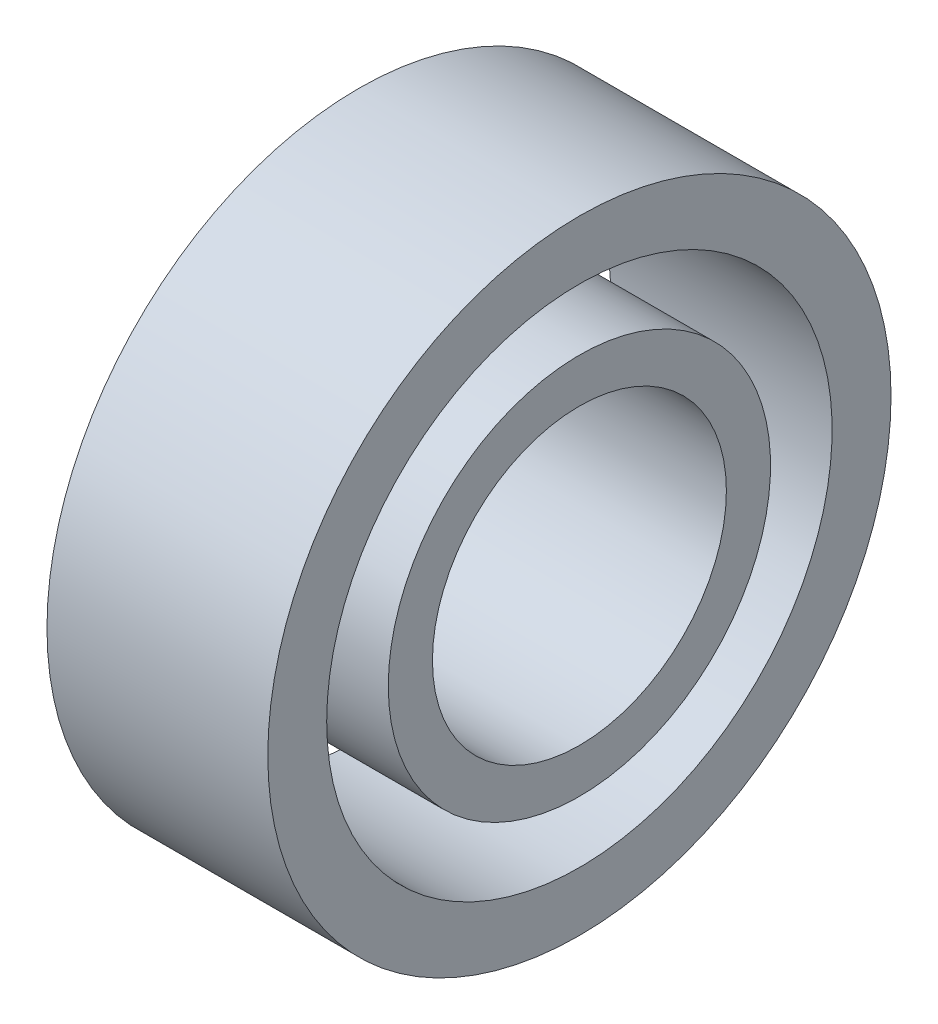
ISO-10303-21;
HEADER;
FILE_DESCRIPTION(('STEP AP214'),'2;1');
FILE_NAME('part.step','',(''),(''),'','','');
FILE_SCHEMA(('AUTOMOTIVE_DESIGN { 1 0 10303 214 1 1 1 1 }'));
ENDSEC;
DATA;
#1=APPLICATION_CONTEXT('core data for automotive mechanical design processes');
#2=APPLICATION_PROTOCOL_DEFINITION('international standard','automotive_design',2000,#1);
#3=PRODUCT_CONTEXT('',#1,'mechanical');
#4=PRODUCT('Part','Part','',(#3));
#5=PRODUCT_RELATED_PRODUCT_CATEGORY('part','',(#4));
#6=PRODUCT_DEFINITION_FORMATION('','',#4);
#7=PRODUCT_DEFINITION_CONTEXT('part definition',#1,'design');
#8=PRODUCT_DEFINITION('design','',#6,#7);
#9=PRODUCT_DEFINITION_SHAPE('','',#8);
#10=(LENGTH_UNIT() NAMED_UNIT(*) SI_UNIT(.MILLI.,.METRE.));
#11=(NAMED_UNIT(*) PLANE_ANGLE_UNIT() SI_UNIT($,.RADIAN.));
#12=(NAMED_UNIT(*) SI_UNIT($,.STERADIAN.) SOLID_ANGLE_UNIT());
#13=UNCERTAINTY_MEASURE_WITH_UNIT(LENGTH_MEASURE(1.E-05),#10,'distance_accuracy_value','');
#14=(GEOMETRIC_REPRESENTATION_CONTEXT(3) GLOBAL_UNCERTAINTY_ASSIGNED_CONTEXT((#13)) GLOBAL_UNIT_ASSIGNED_CONTEXT((#10,
#11,#12)) REPRESENTATION_CONTEXT('',''));
#15=CARTESIAN_POINT('',(0.,0.,0.));
#16=DIRECTION('',(0.,0.,1.));
#17=DIRECTION('',(1.,0.,0.));
#18=AXIS2_PLACEMENT_3D('',#15,#16,#17);
#19=CARTESIAN_POINT('',(-2.25,3.895,0.));
#20=DIRECTION('',(1.,0.,0.));
#21=DIRECTION('',(0.,0.,-1.));
#22=AXIS2_PLACEMENT_3D('',#19,#20,#21);
#23=PLANE('',#22);
#24=CARTESIAN_POINT('',(-2.25,0.,0.));
#25=DIRECTION('',(-1.,0.,0.));
#26=DIRECTION('',(0.,0.,1.));
#27=AXIS2_PLACEMENT_3D('',#24,#25,#26);
#28=CIRCLE('',#27,2.995);
#29=CARTESIAN_POINT('',(-2.25,0.,2.995));
#30=VERTEX_POINT('',#29);
#31=EDGE_CURVE('E11',#30,#30,#28,.T.);
#32=ORIENTED_EDGE('',*,*,#31,.F.);
#33=EDGE_LOOP('',(#32));
#34=FACE_BOUND('',#33,.T.);
#35=CARTESIAN_POINT('',(-2.25,0.,0.));
#36=DIRECTION('',(-1.,0.,0.));
#37=DIRECTION('',(0.,0.,1.));
#38=AXIS2_PLACEMENT_3D('',#35,#36,#37);
#39=CIRCLE('',#38,3.895);
#40=CARTESIAN_POINT('',(-2.25,0.,3.895));
#41=VERTEX_POINT('',#40);
#42=EDGE_CURVE('E59',#41,#41,#39,.T.);
#43=ORIENTED_EDGE('',*,*,#42,.T.);
#44=EDGE_LOOP('',(#43));
#45=FACE_BOUND('',#44,.T.);
#46=ADVANCED_FACE('F45',(#34,#45),#23,.F.);
#47=CARTESIAN_POINT('',(-11.7209302325581,0.,0.));
#48=DIRECTION('',(-1.,0.,0.));
#49=DIRECTION('',(0.,0.,1.));
#50=AXIS2_PLACEMENT_3D('',#47,#48,#49);
#51=CYLINDRICAL_SURFACE('',#50,2.995);
#52=CARTESIAN_POINT('',(2.25,0.,0.));
#53=DIRECTION('',(-1.,0.,0.));
#54=DIRECTION('',(0.,0.,1.));
#55=AXIS2_PLACEMENT_3D('',#52,#53,#54);
#56=CIRCLE('',#55,2.995);
#57=CARTESIAN_POINT('',(2.25,0.,2.995));
#58=VERTEX_POINT('',#57);
#59=EDGE_CURVE('E51',#58,#58,#56,.T.);
#60=ORIENTED_EDGE('',*,*,#59,.F.);
#61=EDGE_LOOP('',(#60));
#62=FACE_BOUND('',#61,.T.);
#63=ORIENTED_EDGE('',*,*,#31,.T.);
#64=EDGE_LOOP('',(#63));
#65=FACE_BOUND('',#64,.T.);
#66=ADVANCED_FACE('F74',(#62,#65),#51,.F.);
#67=CARTESIAN_POINT('',(2.25,3.895,0.));
#68=DIRECTION('',(-1.,0.,0.));
#69=DIRECTION('',(0.,0.,1.));
#70=AXIS2_PLACEMENT_3D('',#67,#68,#69);
#71=PLANE('',#70);
#72=CARTESIAN_POINT('',(2.25,0.,0.));
#73=DIRECTION('',(-1.,0.,0.));
#74=DIRECTION('',(0.,0.,1.));
#75=AXIS2_PLACEMENT_3D('',#72,#73,#74);
#76=CIRCLE('',#75,3.895);
#77=CARTESIAN_POINT('',(2.25,0.,3.895));
#78=VERTEX_POINT('',#77);
#79=EDGE_CURVE('E55',#78,#78,#76,.T.);
#80=ORIENTED_EDGE('',*,*,#79,.F.);
#81=EDGE_LOOP('',(#80));
#82=FACE_BOUND('',#81,.T.);
#83=ORIENTED_EDGE('',*,*,#59,.T.);
#84=EDGE_LOOP('',(#83));
#85=FACE_BOUND('',#84,.T.);
#86=ADVANCED_FACE('F69',(#82,#85),#71,.F.);
#87=CARTESIAN_POINT('',(-11.7209302325581,0.,0.));
#88=DIRECTION('',(-1.,0.,0.));
#89=DIRECTION('',(0.,0.,1.));
#90=AXIS2_PLACEMENT_3D('',#87,#88,#89);
#91=CYLINDRICAL_SURFACE('',#90,3.895);
#92=ORIENTED_EDGE('',*,*,#42,.F.);
#93=EDGE_LOOP('',(#92));
#94=FACE_BOUND('',#93,.T.);
#95=ORIENTED_EDGE('',*,*,#79,.T.);
#96=EDGE_LOOP('',(#95));
#97=FACE_BOUND('',#96,.T.);
#98=ADVANCED_FACE('F66',(#94,#97),#91,.T.);
#99=CLOSED_SHELL('',(#46,#66,#86,#98));
#100=MANIFOLD_SOLID_BREP('B2',#99);
#101=CARTESIAN_POINT('',(-2.25,6.35,0.));
#102=DIRECTION('',(1.,0.,0.));
#103=DIRECTION('',(0.,0.,-1.));
#104=AXIS2_PLACEMENT_3D('',#101,#102,#103);
#105=PLANE('',#104);
#106=CARTESIAN_POINT('',(-2.25,0.,0.));
#107=DIRECTION('',(-1.,0.,0.));
#108=DIRECTION('',(0.,0.,1.));
#109=AXIS2_PLACEMENT_3D('',#106,#107,#108);
#110=CIRCLE('',#109,5.15);
#111=CARTESIAN_POINT('',(-2.25,0.,5.15));
#112=VERTEX_POINT('',#111);
#113=EDGE_CURVE('E44',#112,#112,#110,.T.);
#114=ORIENTED_EDGE('',*,*,#113,.F.);
#115=EDGE_LOOP('',(#114));
#116=FACE_BOUND('',#115,.T.);
#117=CARTESIAN_POINT('',(-2.25,0.,0.));
#118=DIRECTION('',(-1.,0.,0.));
#119=DIRECTION('',(0.,0.,1.));
#120=AXIS2_PLACEMENT_3D('',#117,#118,#119);
#121=CIRCLE('',#120,6.35);
#122=CARTESIAN_POINT('',(-2.25,0.,6.35));
#123=VERTEX_POINT('',#122);
#124=EDGE_CURVE('E121',#123,#123,#121,.T.);
#125=ORIENTED_EDGE('',*,*,#124,.T.);
#126=EDGE_LOOP('',(#125));
#127=FACE_BOUND('',#126,.T.);
#128=ADVANCED_FACE('F107',(#116,#127),#105,.F.);
#129=CARTESIAN_POINT('',(-11.7209302325581,0.,0.));
#130=DIRECTION('',(-1.,0.,0.));
#131=DIRECTION('',(0.,0.,1.));
#132=AXIS2_PLACEMENT_3D('',#129,#130,#131);
#133=CYLINDRICAL_SURFACE('',#132,5.15);
#134=CARTESIAN_POINT('',(2.25,0.,0.));
#135=DIRECTION('',(-1.,0.,0.));
#136=DIRECTION('',(0.,0.,1.));
#137=AXIS2_PLACEMENT_3D('',#134,#135,#136);
#138=CIRCLE('',#137,5.15);
#139=CARTESIAN_POINT('',(2.25,0.,5.15));
#140=VERTEX_POINT('',#139);
#141=EDGE_CURVE('E113',#140,#140,#138,.T.);
#142=ORIENTED_EDGE('',*,*,#141,.F.);
#143=EDGE_LOOP('',(#142));
#144=FACE_BOUND('',#143,.T.);
#145=ORIENTED_EDGE('',*,*,#113,.T.);
#146=EDGE_LOOP('',(#145));
#147=FACE_BOUND('',#146,.T.);
#148=ADVANCED_FACE('F136',(#144,#147),#133,.F.);
#149=CARTESIAN_POINT('',(2.25,6.35,0.));
#150=DIRECTION('',(-1.,0.,0.));
#151=DIRECTION('',(0.,0.,1.));
#152=AXIS2_PLACEMENT_3D('',#149,#150,#151);
#153=PLANE('',#152);
#154=CARTESIAN_POINT('',(2.25,0.,0.));
#155=DIRECTION('',(-1.,0.,0.));
#156=DIRECTION('',(0.,0.,1.));
#157=AXIS2_PLACEMENT_3D('',#154,#155,#156);
#158=CIRCLE('',#157,6.35);
#159=CARTESIAN_POINT('',(2.25,0.,6.35));
#160=VERTEX_POINT('',#159);
#161=EDGE_CURVE('E117',#160,#160,#158,.T.);
#162=ORIENTED_EDGE('',*,*,#161,.F.);
#163=EDGE_LOOP('',(#162));
#164=FACE_BOUND('',#163,.T.);
#165=ORIENTED_EDGE('',*,*,#141,.T.);
#166=EDGE_LOOP('',(#165));
#167=FACE_BOUND('',#166,.T.);
#168=ADVANCED_FACE('F131',(#164,#167),#153,.F.);
#169=CARTESIAN_POINT('',(-11.7209302325581,0.,0.));
#170=DIRECTION('',(-1.,0.,0.));
#171=DIRECTION('',(0.,0.,1.));
#172=AXIS2_PLACEMENT_3D('',#169,#170,#171);
#173=CYLINDRICAL_SURFACE('',#172,6.35);
#174=ORIENTED_EDGE('',*,*,#124,.F.);
#175=EDGE_LOOP('',(#174));
#176=FACE_BOUND('',#175,.T.);
#177=ORIENTED_EDGE('',*,*,#161,.T.);
#178=EDGE_LOOP('',(#177));
#179=FACE_BOUND('',#178,.T.);
#180=ADVANCED_FACE('F128',(#176,#179),#173,.T.);
#181=CLOSED_SHELL('',(#128,#148,#168,#180));
#182=MANIFOLD_SOLID_BREP('B6',#181);
#183=ADVANCED_BREP_SHAPE_REPRESENTATION('',(#18,#100,#182),#14);
#184=SHAPE_DEFINITION_REPRESENTATION(#9,#183);
ENDSEC;
END-ISO-10303-21;
